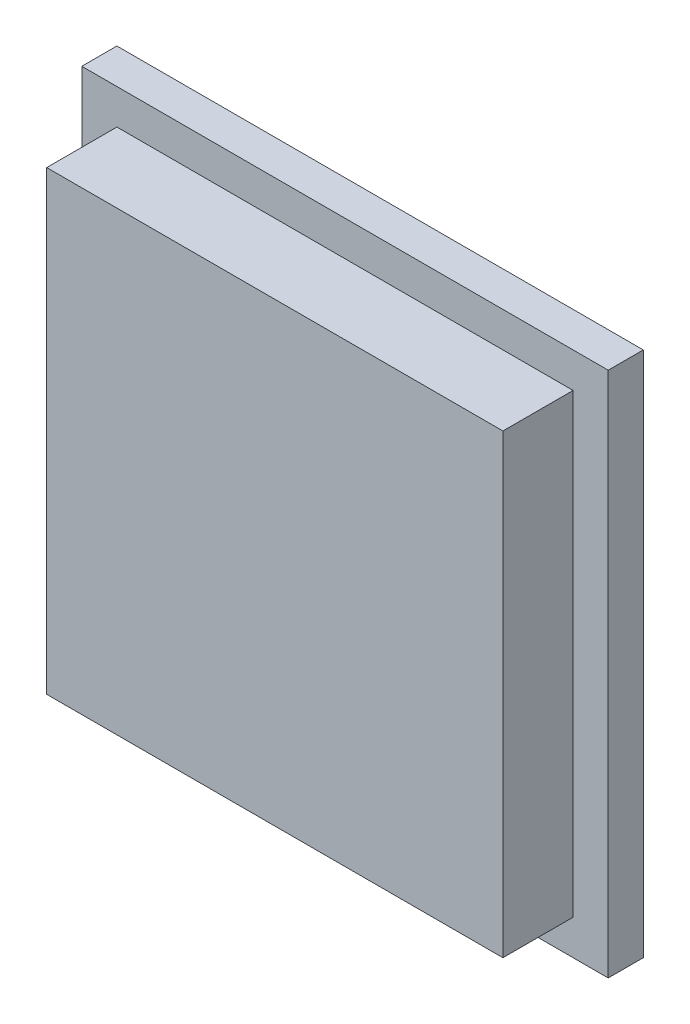
ISO-10303-21;
HEADER;
FILE_DESCRIPTION(('STEP AP214'),'2;1');
FILE_NAME('part.step','',(''),(''),'','','');
FILE_SCHEMA(('AUTOMOTIVE_DESIGN { 1 0 10303 214 1 1 1 1 }'));
ENDSEC;
DATA;
#1=APPLICATION_CONTEXT('core data for automotive mechanical design processes');
#2=APPLICATION_PROTOCOL_DEFINITION('international standard','automotive_design',2000,#1);
#3=PRODUCT_CONTEXT('',#1,'mechanical');
#4=PRODUCT('Part','Part','',(#3));
#5=PRODUCT_RELATED_PRODUCT_CATEGORY('part','',(#4));
#6=PRODUCT_DEFINITION_FORMATION('','',#4);
#7=PRODUCT_DEFINITION_CONTEXT('part definition',#1,'design');
#8=PRODUCT_DEFINITION('design','',#6,#7);
#9=PRODUCT_DEFINITION_SHAPE('','',#8);
#10=(LENGTH_UNIT() NAMED_UNIT(*) SI_UNIT(.MILLI.,.METRE.));
#11=(NAMED_UNIT(*) PLANE_ANGLE_UNIT() SI_UNIT($,.RADIAN.));
#12=(NAMED_UNIT(*) SI_UNIT($,.STERADIAN.) SOLID_ANGLE_UNIT());
#13=UNCERTAINTY_MEASURE_WITH_UNIT(LENGTH_MEASURE(1.E-05),#10,'distance_accuracy_value','');
#14=(GEOMETRIC_REPRESENTATION_CONTEXT(3) GLOBAL_UNCERTAINTY_ASSIGNED_CONTEXT((#13)) GLOBAL_UNIT_ASSIGNED_CONTEXT((#10,
#11,#12)) REPRESENTATION_CONTEXT('',''));
#15=CARTESIAN_POINT('',(0.,0.,0.));
#16=DIRECTION('',(0.,0.,1.));
#17=DIRECTION('',(1.,0.,0.));
#18=AXIS2_PLACEMENT_3D('',#15,#16,#17);
#19=CARTESIAN_POINT('',(0.,0.,10.));
#20=DIRECTION('',(0.,0.,-1.));
#21=DIRECTION('',(-1.,0.,0.));
#22=AXIS2_PLACEMENT_3D('',#19,#20,#21);
#23=PLANE('',#22);
#24=DIRECTION('',(0.,-1.,0.));
#25=VECTOR('',#24,1.);
#26=CARTESIAN_POINT('',(0.,0.,10.));
#27=LINE('',#26,#25);
#28=CARTESIAN_POINT('',(0.,150.,10.));
#29=VERTEX_POINT('',#28);
#30=CARTESIAN_POINT('',(0.,0.,10.));
#31=VERTEX_POINT('',#30);
#32=EDGE_CURVE('E145',#29,#31,#27,.T.);
#33=ORIENTED_EDGE('',*,*,#32,.T.);
#34=DIRECTION('',(1.,0.,0.));
#35=VECTOR('',#34,1.);
#36=CARTESIAN_POINT('',(0.,0.,10.));
#37=LINE('',#36,#35);
#38=CARTESIAN_POINT('',(150.,0.,10.));
#39=VERTEX_POINT('',#38);
#40=EDGE_CURVE('E149',#31,#39,#37,.T.);
#41=ORIENTED_EDGE('',*,*,#40,.T.);
#42=DIRECTION('',(0.,1.,0.));
#43=VECTOR('',#42,1.);
#44=CARTESIAN_POINT('',(150.,0.,10.));
#45=LINE('',#44,#43);
#46=CARTESIAN_POINT('',(150.,150.,10.));
#47=VERTEX_POINT('',#46);
#48=EDGE_CURVE('E153',#39,#47,#45,.T.);
#49=ORIENTED_EDGE('',*,*,#48,.T.);
#50=DIRECTION('',(-1.,0.,0.));
#51=VECTOR('',#50,1.);
#52=CARTESIAN_POINT('',(0.,150.,10.));
#53=LINE('',#52,#51);
#54=EDGE_CURVE('E156',#47,#29,#53,.T.);
#55=ORIENTED_EDGE('',*,*,#54,.T.);
#56=EDGE_LOOP('',(#33,#41,#49,#55));
#57=FACE_BOUND('',#56,.T.);
#58=DIRECTION('',(0.,-1.,0.));
#59=VECTOR('',#58,1.);
#60=CARTESIAN_POINT('',(10.,140.,10.));
#61=LINE('',#60,#59);
#62=CARTESIAN_POINT('',(10.,140.,10.));
#63=VERTEX_POINT('',#62);
#64=CARTESIAN_POINT('',(10.,9.99999999999998,10.));
#65=VERTEX_POINT('',#64);
#66=EDGE_CURVE('E61',#63,#65,#61,.T.);
#67=ORIENTED_EDGE('',*,*,#66,.F.);
#68=DIRECTION('',(-1.,0.,0.));
#69=VECTOR('',#68,1.);
#70=CARTESIAN_POINT('',(10.,140.,10.));
#71=LINE('',#70,#69);
#72=CARTESIAN_POINT('',(140.,140.,10.));
#73=VERTEX_POINT('',#72);
#74=EDGE_CURVE('E65',#73,#63,#71,.T.);
#75=ORIENTED_EDGE('',*,*,#74,.F.);
#76=DIRECTION('',(0.,1.,0.));
#77=VECTOR('',#76,1.);
#78=CARTESIAN_POINT('',(140.,140.,10.));
#79=LINE('',#78,#77);
#80=CARTESIAN_POINT('',(140.,9.99999999999998,10.));
#81=VERTEX_POINT('',#80);
#82=EDGE_CURVE('E274',#81,#73,#79,.T.);
#83=ORIENTED_EDGE('',*,*,#82,.F.);
#84=DIRECTION('',(1.,0.,0.));
#85=VECTOR('',#84,1.);
#86=CARTESIAN_POINT('',(10.,9.99999999999998,10.));
#87=LINE('',#86,#85);
#88=EDGE_CURVE('E284',#65,#81,#87,.T.);
#89=ORIENTED_EDGE('',*,*,#88,.F.);
#90=EDGE_LOOP('',(#67,#75,#83,#89));
#91=FACE_BOUND('',#90,.T.);
#92=ADVANCED_FACE('F45',(#57,#91),#23,.F.);
#93=CARTESIAN_POINT('',(0.,0.,10.));
#94=DIRECTION('',(1.,0.,0.));
#95=DIRECTION('',(0.,0.,-1.));
#96=AXIS2_PLACEMENT_3D('',#93,#94,#95);
#97=PLANE('',#96);
#98=DIRECTION('',(0.,-1.,0.));
#99=VECTOR('',#98,1.);
#100=CARTESIAN_POINT('',(0.,0.,0.));
#101=LINE('',#100,#99);
#102=CARTESIAN_POINT('',(0.,150.,0.));
#103=VERTEX_POINT('',#102);
#104=CARTESIAN_POINT('',(0.,0.,0.));
#105=VERTEX_POINT('',#104);
#106=EDGE_CURVE('E134',#103,#105,#101,.T.);
#107=ORIENTED_EDGE('',*,*,#106,.T.);
#108=DIRECTION('',(0.,0.,-1.));
#109=VECTOR('',#108,1.);
#110=CARTESIAN_POINT('',(0.,0.,10.));
#111=LINE('',#110,#109);
#112=EDGE_CURVE('E11',#31,#105,#111,.T.);
#113=ORIENTED_EDGE('',*,*,#112,.F.);
#114=ORIENTED_EDGE('',*,*,#32,.F.);
#115=DIRECTION('',(0.,0.,-1.));
#116=VECTOR('',#115,1.);
#117=CARTESIAN_POINT('',(0.,150.,10.));
#118=LINE('',#117,#116);
#119=EDGE_CURVE('E158',#29,#103,#118,.T.);
#120=ORIENTED_EDGE('',*,*,#119,.T.);
#121=EDGE_LOOP('',(#107,#113,#114,#120));
#122=FACE_BOUND('',#121,.T.);
#123=ADVANCED_FACE('F47',(#122),#97,.F.);
#124=CARTESIAN_POINT('',(0.,0.,10.));
#125=DIRECTION('',(0.,1.,0.));
#126=DIRECTION('',(0.,0.,1.));
#127=AXIS2_PLACEMENT_3D('',#124,#125,#126);
#128=PLANE('',#127);
#129=DIRECTION('',(1.,0.,0.));
#130=VECTOR('',#129,1.);
#131=CARTESIAN_POINT('',(0.,0.,0.));
#132=LINE('',#131,#130);
#133=CARTESIAN_POINT('',(150.,0.,0.));
#134=VERTEX_POINT('',#133);
#135=EDGE_CURVE('E139',#105,#134,#132,.T.);
#136=ORIENTED_EDGE('',*,*,#135,.T.);
#137=DIRECTION('',(0.,0.,-1.));
#138=VECTOR('',#137,1.);
#139=CARTESIAN_POINT('',(150.,0.,10.));
#140=LINE('',#139,#138);
#141=EDGE_CURVE('E54',#39,#134,#140,.T.);
#142=ORIENTED_EDGE('',*,*,#141,.F.);
#143=ORIENTED_EDGE('',*,*,#40,.F.);
#144=ORIENTED_EDGE('',*,*,#112,.T.);
#145=EDGE_LOOP('',(#136,#142,#143,#144));
#146=FACE_BOUND('',#145,.T.);
#147=ADVANCED_FACE('F194',(#146),#128,.F.);
#148=CARTESIAN_POINT('',(150.,0.,10.));
#149=DIRECTION('',(-1.,0.,0.));
#150=DIRECTION('',(0.,0.,1.));
#151=AXIS2_PLACEMENT_3D('',#148,#149,#150);
#152=PLANE('',#151);
#153=DIRECTION('',(0.,1.,0.));
#154=VECTOR('',#153,1.);
#155=CARTESIAN_POINT('',(150.,0.,0.));
#156=LINE('',#155,#154);
#157=CARTESIAN_POINT('',(150.,150.,0.));
#158=VERTEX_POINT('',#157);
#159=EDGE_CURVE('E162',#134,#158,#156,.T.);
#160=ORIENTED_EDGE('',*,*,#159,.T.);
#161=DIRECTION('',(0.,0.,-1.));
#162=VECTOR('',#161,1.);
#163=CARTESIAN_POINT('',(150.,150.,10.));
#164=LINE('',#163,#162);
#165=EDGE_CURVE('E170',#47,#158,#164,.T.);
#166=ORIENTED_EDGE('',*,*,#165,.F.);
#167=ORIENTED_EDGE('',*,*,#48,.F.);
#168=ORIENTED_EDGE('',*,*,#141,.T.);
#169=EDGE_LOOP('',(#160,#166,#167,#168));
#170=FACE_BOUND('',#169,.T.);
#171=ADVANCED_FACE('F179',(#170),#152,.F.);
#172=CARTESIAN_POINT('',(0.,150.,10.));
#173=DIRECTION('',(0.,-1.,0.));
#174=DIRECTION('',(0.,0.,-1.));
#175=AXIS2_PLACEMENT_3D('',#172,#173,#174);
#176=PLANE('',#175);
#177=DIRECTION('',(-1.,0.,0.));
#178=VECTOR('',#177,1.);
#179=CARTESIAN_POINT('',(0.,150.,0.));
#180=LINE('',#179,#178);
#181=EDGE_CURVE('E150',#158,#103,#180,.T.);
#182=ORIENTED_EDGE('',*,*,#181,.T.);
#183=ORIENTED_EDGE('',*,*,#119,.F.);
#184=ORIENTED_EDGE('',*,*,#54,.F.);
#185=ORIENTED_EDGE('',*,*,#165,.T.);
#186=EDGE_LOOP('',(#182,#183,#184,#185));
#187=FACE_BOUND('',#186,.T.);
#188=ADVANCED_FACE('F188',(#187),#176,.F.);
#189=CARTESIAN_POINT('',(0.,0.,0.));
#190=DIRECTION('',(0.,0.,-1.));
#191=DIRECTION('',(-1.,0.,0.));
#192=AXIS2_PLACEMENT_3D('',#189,#190,#191);
#193=PLANE('',#192);
#194=ORIENTED_EDGE('',*,*,#106,.F.);
#195=ORIENTED_EDGE('',*,*,#181,.F.);
#196=ORIENTED_EDGE('',*,*,#159,.F.);
#197=ORIENTED_EDGE('',*,*,#135,.F.);
#198=EDGE_LOOP('',(#194,#195,#196,#197));
#199=FACE_BOUND('',#198,.T.);
#200=ADVANCED_FACE('F185',(#199),#193,.T.);
#201=CARTESIAN_POINT('',(10.,140.,30.));
#202=DIRECTION('',(1.,0.,0.));
#203=DIRECTION('',(0.,1.,0.));
#204=AXIS2_PLACEMENT_3D('',#201,#202,#203);
#205=PLANE('',#204);
#206=ORIENTED_EDGE('',*,*,#66,.T.);
#207=DIRECTION('',(0.,0.,-1.));
#208=VECTOR('',#207,1.);
#209=CARTESIAN_POINT('',(10.,9.99999999999998,30.));
#210=LINE('',#209,#208);
#211=CARTESIAN_POINT('',(10.,9.99999999999998,30.));
#212=VERTEX_POINT('',#211);
#213=EDGE_CURVE('E114',#212,#65,#210,.T.);
#214=ORIENTED_EDGE('',*,*,#213,.F.);
#215=DIRECTION('',(0.,-1.,0.));
#216=VECTOR('',#215,1.);
#217=CARTESIAN_POINT('',(10.,140.,30.));
#218=LINE('',#217,#216);
#219=CARTESIAN_POINT('',(10.,140.,30.));
#220=VERTEX_POINT('',#219);
#221=EDGE_CURVE('E121',#220,#212,#218,.T.);
#222=ORIENTED_EDGE('',*,*,#221,.F.);
#223=DIRECTION('',(0.,0.,-1.));
#224=VECTOR('',#223,1.);
#225=CARTESIAN_POINT('',(10.,140.,30.));
#226=LINE('',#225,#224);
#227=EDGE_CURVE('E271',#220,#63,#226,.T.);
#228=ORIENTED_EDGE('',*,*,#227,.T.);
#229=EDGE_LOOP('',(#206,#214,#222,#228));
#230=FACE_BOUND('',#229,.T.);
#231=ADVANCED_FACE('F132',(#230),#205,.F.);
#232=CARTESIAN_POINT('',(10.,9.99999999999998,30.));
#233=DIRECTION('',(0.,1.,0.));
#234=DIRECTION('',(0.,0.,1.));
#235=AXIS2_PLACEMENT_3D('',#232,#233,#234);
#236=PLANE('',#235);
#237=ORIENTED_EDGE('',*,*,#88,.T.);
#238=DIRECTION('',(0.,0.,-1.));
#239=VECTOR('',#238,1.);
#240=CARTESIAN_POINT('',(140.,9.99999999999998,30.));
#241=LINE('',#240,#239);
#242=CARTESIAN_POINT('',(140.,9.99999999999998,30.));
#243=VERTEX_POINT('',#242);
#244=EDGE_CURVE('E116',#243,#81,#241,.T.);
#245=ORIENTED_EDGE('',*,*,#244,.F.);
#246=DIRECTION('',(1.,0.,0.));
#247=VECTOR('',#246,1.);
#248=CARTESIAN_POINT('',(10.,9.99999999999998,30.));
#249=LINE('',#248,#247);
#250=EDGE_CURVE('E109',#212,#243,#249,.T.);
#251=ORIENTED_EDGE('',*,*,#250,.F.);
#252=ORIENTED_EDGE('',*,*,#213,.T.);
#253=EDGE_LOOP('',(#237,#245,#251,#252));
#254=FACE_BOUND('',#253,.T.);
#255=ADVANCED_FACE('F112',(#254),#236,.F.);
#256=CARTESIAN_POINT('',(140.,140.,30.));
#257=DIRECTION('',(-1.,0.,0.));
#258=DIRECTION('',(0.,-1.,0.));
#259=AXIS2_PLACEMENT_3D('',#256,#257,#258);
#260=PLANE('',#259);
#261=ORIENTED_EDGE('',*,*,#82,.T.);
#262=DIRECTION('',(0.,0.,-1.));
#263=VECTOR('',#262,1.);
#264=CARTESIAN_POINT('',(140.,140.,30.));
#265=LINE('',#264,#263);
#266=CARTESIAN_POINT('',(140.,140.,30.));
#267=VERTEX_POINT('',#266);
#268=EDGE_CURVE('E141',#267,#73,#265,.T.);
#269=ORIENTED_EDGE('',*,*,#268,.F.);
#270=DIRECTION('',(0.,1.,0.));
#271=VECTOR('',#270,1.);
#272=CARTESIAN_POINT('',(140.,140.,30.));
#273=LINE('',#272,#271);
#274=EDGE_CURVE('E120',#243,#267,#273,.T.);
#275=ORIENTED_EDGE('',*,*,#274,.F.);
#276=ORIENTED_EDGE('',*,*,#244,.T.);
#277=EDGE_LOOP('',(#261,#269,#275,#276));
#278=FACE_BOUND('',#277,.T.);
#279=ADVANCED_FACE('F241',(#278),#260,.F.);
#280=CARTESIAN_POINT('',(10.,140.,30.));
#281=DIRECTION('',(0.,-1.,0.));
#282=DIRECTION('',(0.,0.,-1.));
#283=AXIS2_PLACEMENT_3D('',#280,#281,#282);
#284=PLANE('',#283);
#285=ORIENTED_EDGE('',*,*,#74,.T.);
#286=ORIENTED_EDGE('',*,*,#227,.F.);
#287=DIRECTION('',(-1.,0.,0.));
#288=VECTOR('',#287,1.);
#289=CARTESIAN_POINT('',(10.,140.,30.));
#290=LINE('',#289,#288);
#291=EDGE_CURVE('E126',#267,#220,#290,.T.);
#292=ORIENTED_EDGE('',*,*,#291,.F.);
#293=ORIENTED_EDGE('',*,*,#268,.T.);
#294=EDGE_LOOP('',(#285,#286,#292,#293));
#295=FACE_BOUND('',#294,.T.);
#296=ADVANCED_FACE('F249',(#295),#284,.F.);
#297=CARTESIAN_POINT('',(0.,0.,30.));
#298=DIRECTION('',(0.,0.,1.));
#299=DIRECTION('',(1.,0.,0.));
#300=AXIS2_PLACEMENT_3D('',#297,#298,#299);
#301=PLANE('',#300);
#302=ORIENTED_EDGE('',*,*,#221,.T.);
#303=ORIENTED_EDGE('',*,*,#250,.T.);
#304=ORIENTED_EDGE('',*,*,#274,.T.);
#305=ORIENTED_EDGE('',*,*,#291,.T.);
#306=EDGE_LOOP('',(#302,#303,#304,#305));
#307=FACE_BOUND('',#306,.T.);
#308=ADVANCED_FACE('F124',(#307),#301,.T.);
#309=CLOSED_SHELL('',(#92,#123,#147,#171,#188,#200,#231,#255,#279,#296,#308));
#310=MANIFOLD_SOLID_BREP('B2',#309);
#311=ADVANCED_BREP_SHAPE_REPRESENTATION('',(#18,#310),#14);
#312=SHAPE_DEFINITION_REPRESENTATION(#9,#311);
ENDSEC;
END-ISO-10303-21;
